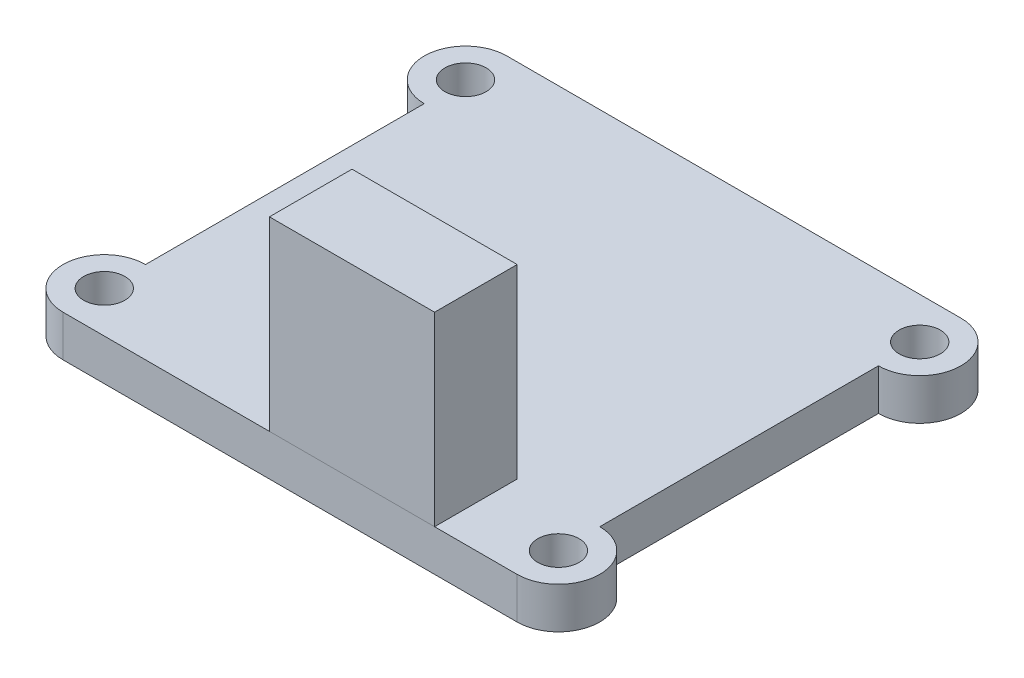
ISO-10303-21;
HEADER;
FILE_DESCRIPTION(('STEP AP214'),'2;1');
FILE_NAME('part.step','',(''),(''),'','','');
FILE_SCHEMA(('AUTOMOTIVE_DESIGN { 1 0 10303 214 1 1 1 1 }'));
ENDSEC;
DATA;
#1=APPLICATION_CONTEXT('core data for automotive mechanical design processes');
#2=APPLICATION_PROTOCOL_DEFINITION('international standard','automotive_design',2000,#1);
#3=PRODUCT_CONTEXT('',#1,'mechanical');
#4=PRODUCT('Part','Part','',(#3));
#5=PRODUCT_RELATED_PRODUCT_CATEGORY('part','',(#4));
#6=PRODUCT_DEFINITION_FORMATION('','',#4);
#7=PRODUCT_DEFINITION_CONTEXT('part definition',#1,'design');
#8=PRODUCT_DEFINITION('design','',#6,#7);
#9=PRODUCT_DEFINITION_SHAPE('','',#8);
#10=(LENGTH_UNIT() NAMED_UNIT(*) SI_UNIT(.MILLI.,.METRE.));
#11=(NAMED_UNIT(*) PLANE_ANGLE_UNIT() SI_UNIT($,.RADIAN.));
#12=(NAMED_UNIT(*) SI_UNIT($,.STERADIAN.) SOLID_ANGLE_UNIT());
#13=UNCERTAINTY_MEASURE_WITH_UNIT(LENGTH_MEASURE(1.E-05),#10,'distance_accuracy_value','');
#14=(GEOMETRIC_REPRESENTATION_CONTEXT(3) GLOBAL_UNCERTAINTY_ASSIGNED_CONTEXT((#13)) GLOBAL_UNIT_ASSIGNED_CONTEXT((#10,
#11,#12)) REPRESENTATION_CONTEXT('',''));
#15=CARTESIAN_POINT('',(0.,0.,0.));
#16=DIRECTION('',(0.,0.,1.));
#17=DIRECTION('',(1.,0.,0.));
#18=AXIS2_PLACEMENT_3D('',#15,#16,#17);
#19=CARTESIAN_POINT('',(-0.999999999999997,11.,10.75));
#20=DIRECTION('',(1.,0.,0.));
#21=DIRECTION('',(0.,0.,-1.));
#22=AXIS2_PLACEMENT_3D('',#19,#20,#21);
#23=PLANE('',#22);
#24=DIRECTION('',(0.,0.,1.));
#25=VECTOR('',#24,1.);
#26=CARTESIAN_POINT('',(-0.999999999999997,2.,10.75));
#27=LINE('',#26,#25);
#28=CARTESIAN_POINT('',(-0.999999999999997,2.,6.75));
#29=VERTEX_POINT('',#28);
#30=CARTESIAN_POINT('',(-0.999999999999997,2.,10.75));
#31=VERTEX_POINT('',#30);
#32=EDGE_CURVE('E118',#29,#31,#27,.T.);
#33=ORIENTED_EDGE('',*,*,#32,.T.);
#34=DIRECTION('',(0.,-1.,0.));
#35=VECTOR('',#34,1.);
#36=CARTESIAN_POINT('',(-0.999999999999997,11.,10.75));
#37=LINE('',#36,#35);
#38=CARTESIAN_POINT('',(-0.999999999999997,11.,10.75));
#39=VERTEX_POINT('',#38);
#40=EDGE_CURVE('E12',#39,#31,#37,.T.);
#41=ORIENTED_EDGE('',*,*,#40,.F.);
#42=DIRECTION('',(0.,0.,1.));
#43=VECTOR('',#42,1.);
#44=CARTESIAN_POINT('',(-0.999999999999997,11.,10.75));
#45=LINE('',#44,#43);
#46=CARTESIAN_POINT('',(-0.999999999999997,11.,6.75));
#47=VERTEX_POINT('',#46);
#48=EDGE_CURVE('E106',#47,#39,#45,.T.);
#49=ORIENTED_EDGE('',*,*,#48,.F.);
#50=DIRECTION('',(0.,-1.,0.));
#51=VECTOR('',#50,1.);
#52=CARTESIAN_POINT('',(-0.999999999999997,11.,6.75));
#53=LINE('',#52,#51);
#54=EDGE_CURVE('E114',#47,#29,#53,.T.);
#55=ORIENTED_EDGE('',*,*,#54,.T.);
#56=EDGE_LOOP('',(#33,#41,#49,#55));
#57=FACE_BOUND('',#56,.T.);
#58=ADVANCED_FACE('F55',(#57),#23,.F.);
#59=CARTESIAN_POINT('',(-0.999999999999997,11.,10.75));
#60=DIRECTION('',(0.,0.,-1.));
#61=DIRECTION('',(-1.,0.,0.));
#62=AXIS2_PLACEMENT_3D('',#59,#60,#61);
#63=PLANE('',#62);
#64=DIRECTION('',(1.,0.,0.));
#65=VECTOR('',#64,1.);
#66=CARTESIAN_POINT('',(-0.999999999999997,2.,10.75));
#67=LINE('',#66,#65);
#68=CARTESIAN_POINT('',(7.,2.,10.75));
#69=VERTEX_POINT('',#68);
#70=EDGE_CURVE('E110',#31,#69,#67,.T.);
#71=ORIENTED_EDGE('',*,*,#70,.T.);
#72=DIRECTION('',(0.,-1.,0.));
#73=VECTOR('',#72,1.);
#74=CARTESIAN_POINT('',(7.,11.,10.75));
#75=LINE('',#74,#73);
#76=CARTESIAN_POINT('',(7.,11.,10.75));
#77=VERTEX_POINT('',#76);
#78=EDGE_CURVE('E63',#77,#69,#75,.T.);
#79=ORIENTED_EDGE('',*,*,#78,.F.);
#80=DIRECTION('',(1.,0.,0.));
#81=VECTOR('',#80,1.);
#82=CARTESIAN_POINT('',(-0.999999999999997,11.,10.75));
#83=LINE('',#82,#81);
#84=EDGE_CURVE('E101',#39,#77,#83,.T.);
#85=ORIENTED_EDGE('',*,*,#84,.F.);
#86=ORIENTED_EDGE('',*,*,#40,.T.);
#87=EDGE_LOOP('',(#71,#79,#85,#86));
#88=FACE_BOUND('',#87,.T.);
#89=ADVANCED_FACE('F109',(#88),#63,.F.);
#90=CARTESIAN_POINT('',(7.,11.,10.75));
#91=DIRECTION('',(-1.,0.,0.));
#92=DIRECTION('',(0.,0.,1.));
#93=AXIS2_PLACEMENT_3D('',#90,#91,#92);
#94=PLANE('',#93);
#95=DIRECTION('',(0.,0.,-1.));
#96=VECTOR('',#95,1.);
#97=CARTESIAN_POINT('',(7.,2.,10.75));
#98=LINE('',#97,#96);
#99=CARTESIAN_POINT('',(7.,2.,6.75));
#100=VERTEX_POINT('',#99);
#101=EDGE_CURVE('E88',#69,#100,#98,.T.);
#102=ORIENTED_EDGE('',*,*,#101,.T.);
#103=DIRECTION('',(0.,-1.,0.));
#104=VECTOR('',#103,1.);
#105=CARTESIAN_POINT('',(7.,11.,6.75));
#106=LINE('',#105,#104);
#107=CARTESIAN_POINT('',(7.,11.,6.75));
#108=VERTEX_POINT('',#107);
#109=EDGE_CURVE('E111',#108,#100,#106,.T.);
#110=ORIENTED_EDGE('',*,*,#109,.F.);
#111=DIRECTION('',(0.,0.,-1.));
#112=VECTOR('',#111,1.);
#113=CARTESIAN_POINT('',(7.,11.,10.75));
#114=LINE('',#113,#112);
#115=EDGE_CURVE('E104',#77,#108,#114,.T.);
#116=ORIENTED_EDGE('',*,*,#115,.F.);
#117=ORIENTED_EDGE('',*,*,#78,.T.);
#118=EDGE_LOOP('',(#102,#110,#116,#117));
#119=FACE_BOUND('',#118,.T.);
#120=ADVANCED_FACE('F112',(#119),#94,.F.);
#121=CARTESIAN_POINT('',(-0.999999999999997,11.,6.75));
#122=DIRECTION('',(0.,0.,1.));
#123=DIRECTION('',(1.,0.,0.));
#124=AXIS2_PLACEMENT_3D('',#121,#122,#123);
#125=PLANE('',#124);
#126=DIRECTION('',(-1.,0.,0.));
#127=VECTOR('',#126,1.);
#128=CARTESIAN_POINT('',(-0.999999999999997,2.,6.75));
#129=LINE('',#128,#127);
#130=EDGE_CURVE('E94',#100,#29,#129,.T.);
#131=ORIENTED_EDGE('',*,*,#130,.T.);
#132=ORIENTED_EDGE('',*,*,#54,.F.);
#133=DIRECTION('',(-1.,0.,0.));
#134=VECTOR('',#133,1.);
#135=CARTESIAN_POINT('',(-0.999999999999997,11.,6.75));
#136=LINE('',#135,#134);
#137=EDGE_CURVE('E71',#108,#47,#136,.T.);
#138=ORIENTED_EDGE('',*,*,#137,.F.);
#139=ORIENTED_EDGE('',*,*,#109,.T.);
#140=EDGE_LOOP('',(#131,#132,#138,#139));
#141=FACE_BOUND('',#140,.T.);
#142=ADVANCED_FACE('F125',(#141),#125,.F.);
#143=CARTESIAN_POINT('',(0.,11.,0.));
#144=DIRECTION('',(0.,-1.,0.));
#145=DIRECTION('',(0.,0.,-1.));
#146=AXIS2_PLACEMENT_3D('',#143,#144,#145);
#147=PLANE('',#146);
#148=ORIENTED_EDGE('',*,*,#48,.T.);
#149=ORIENTED_EDGE('',*,*,#84,.T.);
#150=ORIENTED_EDGE('',*,*,#115,.T.);
#151=ORIENTED_EDGE('',*,*,#137,.T.);
#152=EDGE_LOOP('',(#148,#149,#150,#151));
#153=FACE_BOUND('',#152,.T.);
#154=ADVANCED_FACE('F102',(#153),#147,.F.);
#155=CARTESIAN_POINT('',(0.,2.,0.));
#156=DIRECTION('',(0.,-1.,0.));
#157=DIRECTION('',(0.,0.,-1.));
#158=AXIS2_PLACEMENT_3D('',#155,#156,#157);
#159=PLANE('',#158);
#160=ORIENTED_EDGE('',*,*,#32,.F.);
#161=ORIENTED_EDGE('',*,*,#130,.F.);
#162=ORIENTED_EDGE('',*,*,#101,.F.);
#163=ORIENTED_EDGE('',*,*,#70,.F.);
#164=EDGE_LOOP('',(#160,#161,#162,#163));
#165=FACE_BOUND('',#164,.T.);
#166=ADVANCED_FACE('F128',(#165),#159,.T.);
#167=CLOSED_SHELL('',(#58,#89,#120,#142,#154,#166));
#168=MANIFOLD_SOLID_BREP('B2',#167);
#169=CARTESIAN_POINT('',(11.,2.,-8.75));
#170=DIRECTION('',(0.,-1.,0.));
#171=DIRECTION('',(0.,0.,-1.));
#172=AXIS2_PLACEMENT_3D('',#169,#170,#171);
#173=PLANE('',#172);
#174=CARTESIAN_POINT('',(11.,2.,-8.75));
#175=DIRECTION('',(0.,1.,0.));
#176=DIRECTION('',(0.,0.,-1.));
#177=AXIS2_PLACEMENT_3D('',#174,#175,#176);
#178=CIRCLE('',#177,2.);
#179=CARTESIAN_POINT('',(11.,2.,-6.75));
#180=VERTEX_POINT('',#179);
#181=CARTESIAN_POINT('',(11.,2.,-10.75));
#182=VERTEX_POINT('',#181);
#183=EDGE_CURVE('E315',#180,#182,#178,.T.);
#184=ORIENTED_EDGE('',*,*,#183,.T.);
#185=DIRECTION('',(-1.,0.,0.));
#186=VECTOR('',#185,1.);
#187=CARTESIAN_POINT('',(-11.,2.,-10.75));
#188=LINE('',#187,#186);
#189=CARTESIAN_POINT('',(-11.,2.,-10.75));
#190=VERTEX_POINT('',#189);
#191=EDGE_CURVE('E251',#182,#190,#188,.T.);
#192=ORIENTED_EDGE('',*,*,#191,.T.);
#193=CARTESIAN_POINT('',(-11.,2.,-8.75));
#194=DIRECTION('',(0.,1.,0.));
#195=DIRECTION('',(0.,0.,1.));
#196=AXIS2_PLACEMENT_3D('',#193,#194,#195);
#197=CIRCLE('',#196,2.);
#198=CARTESIAN_POINT('',(-11.,2.,-6.75));
#199=VERTEX_POINT('',#198);
#200=EDGE_CURVE('E336',#190,#199,#197,.T.);
#201=ORIENTED_EDGE('',*,*,#200,.T.);
#202=DIRECTION('',(0.,0.,1.));
#203=VECTOR('',#202,1.);
#204=CARTESIAN_POINT('',(-11.,2.,6.75));
#205=LINE('',#204,#203);
#206=CARTESIAN_POINT('',(-11.,2.,6.75));
#207=VERTEX_POINT('',#206);
#208=EDGE_CURVE('E350',#199,#207,#205,.T.);
#209=ORIENTED_EDGE('',*,*,#208,.T.);
#210=CARTESIAN_POINT('',(-11.,2.,8.75));
#211=DIRECTION('',(0.,1.,0.));
#212=DIRECTION('',(0.,0.,-1.));
#213=AXIS2_PLACEMENT_3D('',#210,#211,#212);
#214=CIRCLE('',#213,2.);
#215=CARTESIAN_POINT('',(-11.,2.,10.75));
#216=VERTEX_POINT('',#215);
#217=EDGE_CURVE('E270',#207,#216,#214,.T.);
#218=ORIENTED_EDGE('',*,*,#217,.T.);
#219=DIRECTION('',(1.,0.,0.));
#220=VECTOR('',#219,1.);
#221=CARTESIAN_POINT('',(-11.,2.,10.75));
#222=LINE('',#221,#220);
#223=CARTESIAN_POINT('',(11.,2.,10.75));
#224=VERTEX_POINT('',#223);
#225=EDGE_CURVE('E264',#216,#224,#222,.T.);
#226=ORIENTED_EDGE('',*,*,#225,.T.);
#227=CARTESIAN_POINT('',(11.,2.,8.75));
#228=DIRECTION('',(0.,1.,0.));
#229=DIRECTION('',(0.,0.,1.));
#230=AXIS2_PLACEMENT_3D('',#227,#228,#229);
#231=CIRCLE('',#230,2.);
#232=CARTESIAN_POINT('',(11.,2.,6.75));
#233=VERTEX_POINT('',#232);
#234=EDGE_CURVE('E268',#224,#233,#231,.T.);
#235=ORIENTED_EDGE('',*,*,#234,.T.);
#236=DIRECTION('',(0.,0.,-1.));
#237=VECTOR('',#236,1.);
#238=CARTESIAN_POINT('',(11.,2.,6.75));
#239=LINE('',#238,#237);
#240=EDGE_CURVE('E208',#233,#180,#239,.T.);
#241=ORIENTED_EDGE('',*,*,#240,.T.);
#242=EDGE_LOOP('',(#184,#192,#201,#209,#218,#226,#235,#241));
#243=FACE_BOUND('',#242,.T.);
#244=CARTESIAN_POINT('',(11.,2.,-8.75));
#245=DIRECTION('',(0.,1.,0.));
#246=DIRECTION('',(0.,0.,-1.));
#247=AXIS2_PLACEMENT_3D('',#244,#245,#246);
#248=CIRCLE('',#247,1.);
#249=CARTESIAN_POINT('',(11.,2.,-9.75000000000001));
#250=VERTEX_POINT('',#249);
#251=EDGE_CURVE('E297',#250,#250,#248,.T.);
#252=ORIENTED_EDGE('',*,*,#251,.F.);
#253=EDGE_LOOP('',(#252));
#254=FACE_BOUND('',#253,.T.);
#255=CARTESIAN_POINT('',(-11.,2.,-8.75));
#256=DIRECTION('',(0.,1.,0.));
#257=DIRECTION('',(0.,0.,1.));
#258=AXIS2_PLACEMENT_3D('',#255,#256,#257);
#259=CIRCLE('',#258,1.);
#260=CARTESIAN_POINT('',(-11.,2.,-7.75));
#261=VERTEX_POINT('',#260);
#262=EDGE_CURVE('E364',#261,#261,#259,.T.);
#263=ORIENTED_EDGE('',*,*,#262,.F.);
#264=EDGE_LOOP('',(#263));
#265=FACE_BOUND('',#264,.T.);
#266=CARTESIAN_POINT('',(11.,2.,8.75));
#267=DIRECTION('',(0.,1.,0.));
#268=DIRECTION('',(0.,0.,1.));
#269=AXIS2_PLACEMENT_3D('',#266,#267,#268);
#270=CIRCLE('',#269,1.);
#271=CARTESIAN_POINT('',(11.,2.,9.75000000000001));
#272=VERTEX_POINT('',#271);
#273=EDGE_CURVE('E372',#272,#272,#270,.T.);
#274=ORIENTED_EDGE('',*,*,#273,.F.);
#275=EDGE_LOOP('',(#274));
#276=FACE_BOUND('',#275,.T.);
#277=CARTESIAN_POINT('',(-11.,2.,8.75));
#278=DIRECTION('',(0.,1.,0.));
#279=DIRECTION('',(0.,0.,-1.));
#280=AXIS2_PLACEMENT_3D('',#277,#278,#279);
#281=CIRCLE('',#280,1.);
#282=CARTESIAN_POINT('',(-11.,2.,7.75));
#283=VERTEX_POINT('',#282);
#284=EDGE_CURVE('E380',#283,#283,#281,.T.);
#285=ORIENTED_EDGE('',*,*,#284,.F.);
#286=EDGE_LOOP('',(#285));
#287=FACE_BOUND('',#286,.T.);
#288=ADVANCED_FACE('F190',(#243,#254,#265,#276,#287),#173,.F.);
#289=CARTESIAN_POINT('',(11.,0.,-8.75));
#290=DIRECTION('',(0.,-1.,0.));
#291=DIRECTION('',(0.,0.,-1.));
#292=AXIS2_PLACEMENT_3D('',#289,#290,#291);
#293=PLANE('',#292);
#294=CARTESIAN_POINT('',(11.,0.,8.75));
#295=DIRECTION('',(0.,1.,0.));
#296=DIRECTION('',(0.,0.,1.));
#297=AXIS2_PLACEMENT_3D('',#294,#295,#296);
#298=CIRCLE('',#297,1.);
#299=CARTESIAN_POINT('',(11.,0.,9.75000000000001));
#300=VERTEX_POINT('',#299);
#301=EDGE_CURVE('E376',#300,#300,#298,.T.);
#302=ORIENTED_EDGE('',*,*,#301,.T.);
#303=EDGE_LOOP('',(#302));
#304=FACE_BOUND('',#303,.T.);
#305=CARTESIAN_POINT('',(11.,0.,-8.75));
#306=DIRECTION('',(0.,1.,0.));
#307=DIRECTION('',(0.,0.,-1.));
#308=AXIS2_PLACEMENT_3D('',#305,#306,#307);
#309=CIRCLE('',#308,1.);
#310=CARTESIAN_POINT('',(11.,0.,-9.75000000000001));
#311=VERTEX_POINT('',#310);
#312=EDGE_CURVE('E360',#311,#311,#309,.T.);
#313=ORIENTED_EDGE('',*,*,#312,.T.);
#314=EDGE_LOOP('',(#313));
#315=FACE_BOUND('',#314,.T.);
#316=CARTESIAN_POINT('',(11.,0.,-8.75));
#317=DIRECTION('',(0.,1.,0.));
#318=DIRECTION('',(0.,0.,-1.));
#319=AXIS2_PLACEMENT_3D('',#316,#317,#318);
#320=CIRCLE('',#319,2.);
#321=CARTESIAN_POINT('',(11.,0.,-6.75));
#322=VERTEX_POINT('',#321);
#323=CARTESIAN_POINT('',(11.,0.,-10.75));
#324=VERTEX_POINT('',#323);
#325=EDGE_CURVE('E292',#322,#324,#320,.T.);
#326=ORIENTED_EDGE('',*,*,#325,.F.);
#327=DIRECTION('',(0.,0.,-1.));
#328=VECTOR('',#327,1.);
#329=CARTESIAN_POINT('',(11.,0.,6.75));
#330=LINE('',#329,#328);
#331=CARTESIAN_POINT('',(11.,0.,6.75));
#332=VERTEX_POINT('',#331);
#333=EDGE_CURVE('E243',#332,#322,#330,.T.);
#334=ORIENTED_EDGE('',*,*,#333,.F.);
#335=CARTESIAN_POINT('',(11.,0.,8.75));
#336=DIRECTION('',(0.,1.,0.));
#337=DIRECTION('',(0.,0.,1.));
#338=AXIS2_PLACEMENT_3D('',#335,#336,#337);
#339=CIRCLE('',#338,2.);
#340=CARTESIAN_POINT('',(11.,0.,10.75));
#341=VERTEX_POINT('',#340);
#342=EDGE_CURVE('E237',#341,#332,#339,.T.);
#343=ORIENTED_EDGE('',*,*,#342,.F.);
#344=DIRECTION('',(1.,0.,0.));
#345=VECTOR('',#344,1.);
#346=CARTESIAN_POINT('',(-11.,0.,10.75));
#347=LINE('',#346,#345);
#348=CARTESIAN_POINT('',(-11.,0.,10.75));
#349=VERTEX_POINT('',#348);
#350=EDGE_CURVE('E279',#349,#341,#347,.T.);
#351=ORIENTED_EDGE('',*,*,#350,.F.);
#352=CARTESIAN_POINT('',(-11.,0.,8.75));
#353=DIRECTION('',(0.,1.,0.));
#354=DIRECTION('',(0.,0.,-1.));
#355=AXIS2_PLACEMENT_3D('',#352,#353,#354);
#356=CIRCLE('',#355,2.);
#357=CARTESIAN_POINT('',(-11.,0.,6.75));
#358=VERTEX_POINT('',#357);
#359=EDGE_CURVE('E306',#358,#349,#356,.T.);
#360=ORIENTED_EDGE('',*,*,#359,.F.);
#361=DIRECTION('',(0.,0.,1.));
#362=VECTOR('',#361,1.);
#363=CARTESIAN_POINT('',(-11.,0.,6.75));
#364=LINE('',#363,#362);
#365=CARTESIAN_POINT('',(-11.,0.,-6.75));
#366=VERTEX_POINT('',#365);
#367=EDGE_CURVE('E303',#366,#358,#364,.T.);
#368=ORIENTED_EDGE('',*,*,#367,.F.);
#369=CARTESIAN_POINT('',(-11.,0.,-8.75));
#370=DIRECTION('',(0.,1.,0.));
#371=DIRECTION('',(0.,0.,1.));
#372=AXIS2_PLACEMENT_3D('',#369,#370,#371);
#373=CIRCLE('',#372,2.);
#374=CARTESIAN_POINT('',(-11.,0.,-10.75));
#375=VERTEX_POINT('',#374);
#376=EDGE_CURVE('E300',#375,#366,#373,.T.);
#377=ORIENTED_EDGE('',*,*,#376,.F.);
#378=DIRECTION('',(-1.,0.,0.));
#379=VECTOR('',#378,1.);
#380=CARTESIAN_POINT('',(-11.,0.,-10.75));
#381=LINE('',#380,#379);
#382=EDGE_CURVE('E296',#324,#375,#381,.T.);
#383=ORIENTED_EDGE('',*,*,#382,.F.);
#384=EDGE_LOOP('',(#326,#334,#343,#351,#360,#368,#377,#383));
#385=FACE_BOUND('',#384,.T.);
#386=CARTESIAN_POINT('',(-11.,0.,-8.75));
#387=DIRECTION('',(0.,1.,0.));
#388=DIRECTION('',(0.,0.,1.));
#389=AXIS2_PLACEMENT_3D('',#386,#387,#388);
#390=CIRCLE('',#389,1.);
#391=CARTESIAN_POINT('',(-11.,0.,-7.75));
#392=VERTEX_POINT('',#391);
#393=EDGE_CURVE('E368',#392,#392,#390,.T.);
#394=ORIENTED_EDGE('',*,*,#393,.T.);
#395=EDGE_LOOP('',(#394));
#396=FACE_BOUND('',#395,.T.);
#397=CARTESIAN_POINT('',(-11.,0.,8.75));
#398=DIRECTION('',(0.,1.,0.));
#399=DIRECTION('',(0.,0.,-1.));
#400=AXIS2_PLACEMENT_3D('',#397,#398,#399);
#401=CIRCLE('',#400,1.);
#402=CARTESIAN_POINT('',(-11.,0.,7.75));
#403=VERTEX_POINT('',#402);
#404=EDGE_CURVE('E384',#403,#403,#401,.T.);
#405=ORIENTED_EDGE('',*,*,#404,.T.);
#406=EDGE_LOOP('',(#405));
#407=FACE_BOUND('',#406,.T.);
#408=ADVANCED_FACE('F340',(#304,#315,#385,#396,#407),#293,.T.);
#409=CARTESIAN_POINT('',(11.,2.,-8.75));
#410=DIRECTION('',(0.,-1.,0.));
#411=DIRECTION('',(0.,0.,-1.));
#412=AXIS2_PLACEMENT_3D('',#409,#410,#411);
#413=CYLINDRICAL_SURFACE('',#412,2.);
#414=ORIENTED_EDGE('',*,*,#325,.T.);
#415=DIRECTION('',(0.,-1.,0.));
#416=VECTOR('',#415,1.);
#417=CARTESIAN_POINT('',(11.,2.,-10.75));
#418=LINE('',#417,#416);
#419=EDGE_CURVE('E53',#182,#324,#418,.T.);
#420=ORIENTED_EDGE('',*,*,#419,.F.);
#421=ORIENTED_EDGE('',*,*,#183,.F.);
#422=DIRECTION('',(0.,-1.,0.));
#423=VECTOR('',#422,1.);
#424=CARTESIAN_POINT('',(11.,2.,-6.75));
#425=LINE('',#424,#423);
#426=EDGE_CURVE('E288',#180,#322,#425,.T.);
#427=ORIENTED_EDGE('',*,*,#426,.T.);
#428=EDGE_LOOP('',(#414,#420,#421,#427));
#429=FACE_BOUND('',#428,.T.);
#430=ADVANCED_FACE('F192',(#429),#413,.T.);
#431=CARTESIAN_POINT('',(-11.,2.,-10.75));
#432=DIRECTION('',(0.,0.,1.));
#433=DIRECTION('',(1.,0.,0.));
#434=AXIS2_PLACEMENT_3D('',#431,#432,#433);
#435=PLANE('',#434);
#436=ORIENTED_EDGE('',*,*,#382,.T.);
#437=DIRECTION('',(0.,-1.,0.));
#438=VECTOR('',#437,1.);
#439=CARTESIAN_POINT('',(-11.,2.,-10.75));
#440=LINE('',#439,#438);
#441=EDGE_CURVE('E200',#190,#375,#440,.T.);
#442=ORIENTED_EDGE('',*,*,#441,.F.);
#443=ORIENTED_EDGE('',*,*,#191,.F.);
#444=ORIENTED_EDGE('',*,*,#419,.T.);
#445=EDGE_LOOP('',(#436,#442,#443,#444));
#446=FACE_BOUND('',#445,.T.);
#447=ADVANCED_FACE('F418',(#446),#435,.F.);
#448=CARTESIAN_POINT('',(-11.,2.,-8.75));
#449=DIRECTION('',(0.,-1.,0.));
#450=DIRECTION('',(0.,0.,-1.));
#451=AXIS2_PLACEMENT_3D('',#448,#449,#450);
#452=CYLINDRICAL_SURFACE('',#451,2.);
#453=ORIENTED_EDGE('',*,*,#376,.T.);
#454=DIRECTION('',(0.,-1.,0.));
#455=VECTOR('',#454,1.);
#456=CARTESIAN_POINT('',(-11.,2.,-6.75));
#457=LINE('',#456,#455);
#458=EDGE_CURVE('E326',#199,#366,#457,.T.);
#459=ORIENTED_EDGE('',*,*,#458,.F.);
#460=ORIENTED_EDGE('',*,*,#200,.F.);
#461=ORIENTED_EDGE('',*,*,#441,.T.);
#462=EDGE_LOOP('',(#453,#459,#460,#461));
#463=FACE_BOUND('',#462,.T.);
#464=ADVANCED_FACE('F334',(#463),#452,.T.);
#465=CARTESIAN_POINT('',(-11.,2.,6.75));
#466=DIRECTION('',(1.,0.,0.));
#467=DIRECTION('',(0.,0.,-1.));
#468=AXIS2_PLACEMENT_3D('',#465,#466,#467);
#469=PLANE('',#468);
#470=ORIENTED_EDGE('',*,*,#367,.T.);
#471=DIRECTION('',(0.,-1.,0.));
#472=VECTOR('',#471,1.);
#473=CARTESIAN_POINT('',(-11.,2.,6.75));
#474=LINE('',#473,#472);
#475=EDGE_CURVE('E322',#207,#358,#474,.T.);
#476=ORIENTED_EDGE('',*,*,#475,.F.);
#477=ORIENTED_EDGE('',*,*,#208,.F.);
#478=ORIENTED_EDGE('',*,*,#458,.T.);
#479=EDGE_LOOP('',(#470,#476,#477,#478));
#480=FACE_BOUND('',#479,.T.);
#481=ADVANCED_FACE('F345',(#480),#469,.F.);
#482=CARTESIAN_POINT('',(-11.,2.,8.75));
#483=DIRECTION('',(0.,-1.,0.));
#484=DIRECTION('',(0.,0.,-1.));
#485=AXIS2_PLACEMENT_3D('',#482,#483,#484);
#486=CYLINDRICAL_SURFACE('',#485,2.);
#487=ORIENTED_EDGE('',*,*,#359,.T.);
#488=DIRECTION('',(0.,-1.,0.));
#489=VECTOR('',#488,1.);
#490=CARTESIAN_POINT('',(-11.,2.,10.75));
#491=LINE('',#490,#489);
#492=EDGE_CURVE('E281',#216,#349,#491,.T.);
#493=ORIENTED_EDGE('',*,*,#492,.F.);
#494=ORIENTED_EDGE('',*,*,#217,.F.);
#495=ORIENTED_EDGE('',*,*,#475,.T.);
#496=EDGE_LOOP('',(#487,#493,#494,#495));
#497=FACE_BOUND('',#496,.T.);
#498=ADVANCED_FACE('F348',(#497),#486,.T.);
#499=CARTESIAN_POINT('',(-11.,2.,10.75));
#500=DIRECTION('',(0.,0.,-1.));
#501=DIRECTION('',(-1.,0.,0.));
#502=AXIS2_PLACEMENT_3D('',#499,#500,#501);
#503=PLANE('',#502);
#504=ORIENTED_EDGE('',*,*,#350,.T.);
#505=DIRECTION('',(0.,-1.,0.));
#506=VECTOR('',#505,1.);
#507=CARTESIAN_POINT('',(11.,2.,10.75));
#508=LINE('',#507,#506);
#509=EDGE_CURVE('E276',#224,#341,#508,.T.);
#510=ORIENTED_EDGE('',*,*,#509,.F.);
#511=ORIENTED_EDGE('',*,*,#225,.F.);
#512=ORIENTED_EDGE('',*,*,#492,.T.);
#513=EDGE_LOOP('',(#504,#510,#511,#512));
#514=FACE_BOUND('',#513,.T.);
#515=ADVANCED_FACE('F277',(#514),#503,.F.);
#516=CARTESIAN_POINT('',(11.,2.,8.75));
#517=DIRECTION('',(0.,-1.,0.));
#518=DIRECTION('',(0.,0.,-1.));
#519=AXIS2_PLACEMENT_3D('',#516,#517,#518);
#520=CYLINDRICAL_SURFACE('',#519,2.);
#521=ORIENTED_EDGE('',*,*,#342,.T.);
#522=DIRECTION('',(0.,-1.,0.));
#523=VECTOR('',#522,1.);
#524=CARTESIAN_POINT('',(11.,2.,6.75));
#525=LINE('',#524,#523);
#526=EDGE_CURVE('E282',#233,#332,#525,.T.);
#527=ORIENTED_EDGE('',*,*,#526,.F.);
#528=ORIENTED_EDGE('',*,*,#234,.F.);
#529=ORIENTED_EDGE('',*,*,#509,.T.);
#530=EDGE_LOOP('',(#521,#527,#528,#529));
#531=FACE_BOUND('',#530,.T.);
#532=ADVANCED_FACE('F284',(#531),#520,.T.);
#533=CARTESIAN_POINT('',(11.,2.,6.75));
#534=DIRECTION('',(-1.,0.,0.));
#535=DIRECTION('',(0.,0.,1.));
#536=AXIS2_PLACEMENT_3D('',#533,#534,#535);
#537=PLANE('',#536);
#538=ORIENTED_EDGE('',*,*,#333,.T.);
#539=ORIENTED_EDGE('',*,*,#426,.F.);
#540=ORIENTED_EDGE('',*,*,#240,.F.);
#541=ORIENTED_EDGE('',*,*,#526,.T.);
#542=EDGE_LOOP('',(#538,#539,#540,#541));
#543=FACE_BOUND('',#542,.T.);
#544=ADVANCED_FACE('F406',(#543),#537,.F.);
#545=CARTESIAN_POINT('',(11.,2.,-8.75));
#546=DIRECTION('',(0.,-1.,0.));
#547=DIRECTION('',(0.,0.,-1.));
#548=AXIS2_PLACEMENT_3D('',#545,#546,#547);
#549=CYLINDRICAL_SURFACE('',#548,1.);
#550=ORIENTED_EDGE('',*,*,#251,.T.);
#551=EDGE_LOOP('',(#550));
#552=FACE_BOUND('',#551,.T.);
#553=ORIENTED_EDGE('',*,*,#312,.F.);
#554=EDGE_LOOP('',(#553));
#555=FACE_BOUND('',#554,.T.);
#556=ADVANCED_FACE('F403',(#552,#555),#549,.F.);
#557=CARTESIAN_POINT('',(-11.,2.,-8.75));
#558=DIRECTION('',(0.,-1.,0.));
#559=DIRECTION('',(0.,0.,-1.));
#560=AXIS2_PLACEMENT_3D('',#557,#558,#559);
#561=CYLINDRICAL_SURFACE('',#560,1.);
#562=ORIENTED_EDGE('',*,*,#262,.T.);
#563=EDGE_LOOP('',(#562));
#564=FACE_BOUND('',#563,.T.);
#565=ORIENTED_EDGE('',*,*,#393,.F.);
#566=EDGE_LOOP('',(#565));
#567=FACE_BOUND('',#566,.T.);
#568=ADVANCED_FACE('F494',(#564,#567),#561,.F.);
#569=CARTESIAN_POINT('',(11.,2.,8.75));
#570=DIRECTION('',(0.,-1.,0.));
#571=DIRECTION('',(0.,0.,-1.));
#572=AXIS2_PLACEMENT_3D('',#569,#570,#571);
#573=CYLINDRICAL_SURFACE('',#572,1.);
#574=ORIENTED_EDGE('',*,*,#273,.T.);
#575=EDGE_LOOP('',(#574));
#576=FACE_BOUND('',#575,.T.);
#577=ORIENTED_EDGE('',*,*,#301,.F.);
#578=EDGE_LOOP('',(#577));
#579=FACE_BOUND('',#578,.T.);
#580=ADVANCED_FACE('F503',(#576,#579),#573,.F.);
#581=CARTESIAN_POINT('',(-11.,2.,8.75));
#582=DIRECTION('',(0.,-1.,0.));
#583=DIRECTION('',(0.,0.,-1.));
#584=AXIS2_PLACEMENT_3D('',#581,#582,#583);
#585=CYLINDRICAL_SURFACE('',#584,1.);
#586=ORIENTED_EDGE('',*,*,#284,.T.);
#587=EDGE_LOOP('',(#586));
#588=FACE_BOUND('',#587,.T.);
#589=ORIENTED_EDGE('',*,*,#404,.F.);
#590=EDGE_LOOP('',(#589));
#591=FACE_BOUND('',#590,.T.);
#592=ADVANCED_FACE('F392',(#588,#591),#585,.F.);
#593=CLOSED_SHELL('',(#288,#408,#430,#447,#464,#481,#498,#515,#532,#544,#556,#568,#580,#592));
#594=MANIFOLD_SOLID_BREP('B6',#593);
#595=ADVANCED_BREP_SHAPE_REPRESENTATION('',(#18,#168,#594),#14);
#596=SHAPE_DEFINITION_REPRESENTATION(#9,#595);
ENDSEC;
END-ISO-10303-21;
